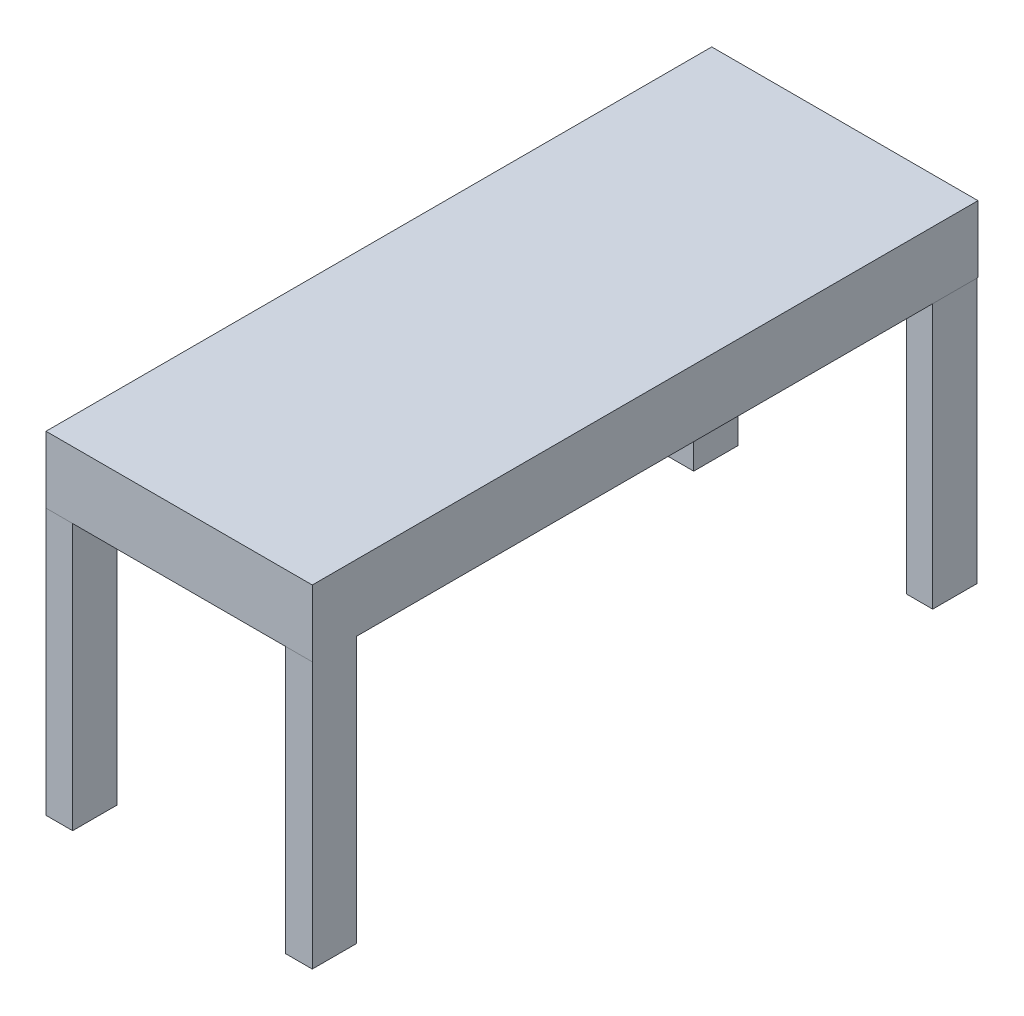
ISO-10303-21;
HEADER;
FILE_DESCRIPTION(('STEP AP214'),'2;1');
FILE_NAME('part.step','',(''),(''),'','','');
FILE_SCHEMA(('AUTOMOTIVE_DESIGN { 1 0 10303 214 1 1 1 1 }'));
ENDSEC;
DATA;
#1=APPLICATION_CONTEXT('core data for automotive mechanical design processes');
#2=APPLICATION_PROTOCOL_DEFINITION('international standard','automotive_design',2000,#1);
#3=PRODUCT_CONTEXT('',#1,'mechanical');
#4=PRODUCT('Part','Part','',(#3));
#5=PRODUCT_RELATED_PRODUCT_CATEGORY('part','',(#4));
#6=PRODUCT_DEFINITION_FORMATION('','',#4);
#7=PRODUCT_DEFINITION_CONTEXT('part definition',#1,'design');
#8=PRODUCT_DEFINITION('design','',#6,#7);
#9=PRODUCT_DEFINITION_SHAPE('','',#8);
#10=(LENGTH_UNIT() NAMED_UNIT(*) SI_UNIT(.MILLI.,.METRE.));
#11=(NAMED_UNIT(*) PLANE_ANGLE_UNIT() SI_UNIT($,.RADIAN.));
#12=(NAMED_UNIT(*) SI_UNIT($,.STERADIAN.) SOLID_ANGLE_UNIT());
#13=UNCERTAINTY_MEASURE_WITH_UNIT(LENGTH_MEASURE(1.E-05),#10,'distance_accuracy_value','');
#14=(GEOMETRIC_REPRESENTATION_CONTEXT(3) GLOBAL_UNCERTAINTY_ASSIGNED_CONTEXT((#13)) GLOBAL_UNIT_ASSIGNED_CONTEXT((#10,
#11,#12)) REPRESENTATION_CONTEXT('',''));
#15=CARTESIAN_POINT('',(0.,0.,0.));
#16=DIRECTION('',(0.,0.,1.));
#17=DIRECTION('',(1.,0.,0.));
#18=AXIS2_PLACEMENT_3D('',#15,#16,#17);
#19=CARTESIAN_POINT('',(76.2,-38.2485648275946,101.512948026485));
#20=DIRECTION('',(0.,1.,0.));
#21=DIRECTION('',(0.,0.,1.));
#22=AXIS2_PLACEMENT_3D('',#19,#20,#21);
#23=PLANE('',#22);
#24=DIRECTION('',(0.,0.,1.));
#25=VECTOR('',#24,1.);
#26=CARTESIAN_POINT('',(68.58,-38.2485648275946,-88.9913319064604));
#27=LINE('',#26,#25);
#28=CARTESIAN_POINT('',(68.58,-38.2485648275946,88.8129480264851));
#29=VERTEX_POINT('',#28);
#30=CARTESIAN_POINT('',(68.58,-38.2485648275946,101.512948026485));
#31=VERTEX_POINT('',#30);
#32=EDGE_CURVE('E200',#29,#31,#27,.T.);
#33=ORIENTED_EDGE('',*,*,#32,.F.);
#34=DIRECTION('',(-1.,0.,0.));
#35=VECTOR('',#34,1.);
#36=CARTESIAN_POINT('',(76.2,-38.2485648275946,88.8129480264851));
#37=LINE('',#36,#35);
#38=CARTESIAN_POINT('',(76.2,-38.2485648275946,88.8129480264851));
#39=VERTEX_POINT('',#38);
#40=EDGE_CURVE('E208',#39,#29,#37,.T.);
#41=ORIENTED_EDGE('',*,*,#40,.F.);
#42=DIRECTION('',(0.,0.,-1.));
#43=VECTOR('',#42,1.);
#44=CARTESIAN_POINT('',(76.2,-38.2485648275946,101.512948026485));
#45=LINE('',#44,#43);
#46=CARTESIAN_POINT('',(76.2,-38.2485648275946,101.512948026485));
#47=VERTEX_POINT('',#46);
#48=EDGE_CURVE('E217',#47,#39,#45,.T.);
#49=ORIENTED_EDGE('',*,*,#48,.F.);
#50=DIRECTION('',(-1.,0.,0.));
#51=VECTOR('',#50,1.);
#52=CARTESIAN_POINT('',(76.2,-38.2485648275946,101.512948026485));
#53=LINE('',#52,#51);
#54=EDGE_CURVE('E207',#47,#31,#53,.T.);
#55=ORIENTED_EDGE('',*,*,#54,.T.);
#56=EDGE_LOOP('',(#33,#41,#49,#55));
#57=FACE_BOUND('',#56,.T.);
#58=ADVANCED_FACE('F43',(#57),#23,.F.);
#59=CARTESIAN_POINT('',(76.0109184171338,38.1867404796572,-76.2170484762748));
#60=DIRECTION('',(0.,0.,-1.));
#61=DIRECTION('',(-1.,0.,0.));
#62=AXIS2_PLACEMENT_3D('',#59,#60,#61);
#63=PLANE('',#62);
#64=DIRECTION('',(0.,1.,0.));
#65=VECTOR('',#64,1.);
#66=CARTESIAN_POINT('',(68.58,38.1867404796572,-76.2170484762748));
#67=LINE('',#66,#65);
#68=CARTESIAN_POINT('',(68.58,-38.0132595203428,-76.2170484762748));
#69=VERTEX_POINT('',#68);
#70=CARTESIAN_POINT('',(68.58,37.8905634643858,-76.2170484762748));
#71=VERTEX_POINT('',#70);
#72=EDGE_CURVE('E414',#69,#71,#67,.T.);
#73=ORIENTED_EDGE('',*,*,#72,.F.);
#74=DIRECTION('',(-1.,0.,0.));
#75=VECTOR('',#74,1.);
#76=CARTESIAN_POINT('',(76.0109184171338,-38.0132595203428,-76.2170484762748));
#77=LINE('',#76,#75);
#78=CARTESIAN_POINT('',(76.0109184171338,-38.0132595203428,-76.2170484762748));
#79=VERTEX_POINT('',#78);
#80=EDGE_CURVE('E343',#79,#69,#77,.T.);
#81=ORIENTED_EDGE('',*,*,#80,.F.);
#82=DIRECTION('',(0.,-1.,0.));
#83=VECTOR('',#82,1.);
#84=CARTESIAN_POINT('',(76.0109184171338,38.1867404796572,-76.2170484762748));
#85=LINE('',#84,#83);
#86=CARTESIAN_POINT('',(76.0109184171338,37.8905634643858,-76.2170484762748));
#87=VERTEX_POINT('',#86);
#88=EDGE_CURVE('E323',#87,#79,#85,.T.);
#89=ORIENTED_EDGE('',*,*,#88,.F.);
#90=DIRECTION('',(1.,0.,0.));
#91=VECTOR('',#90,1.);
#92=CARTESIAN_POINT('',(76.0109184171338,37.8905634643858,-76.2170484762748));
#93=LINE('',#92,#91);
#94=EDGE_CURVE('E318',#71,#87,#93,.T.);
#95=ORIENTED_EDGE('',*,*,#94,.F.);
#96=EDGE_LOOP('',(#73,#81,#89,#95));
#97=FACE_BOUND('',#96,.T.);
#98=ADVANCED_FACE('F452',(#97),#63,.F.);
#99=CARTESIAN_POINT('',(76.0109184171338,38.1867404796572,-88.9170484762748));
#100=DIRECTION('',(0.,0.,1.));
#101=DIRECTION('',(0.,-1.,0.));
#102=AXIS2_PLACEMENT_3D('',#99,#100,#101);
#103=PLANE('',#102);
#104=DIRECTION('',(0.,-1.,0.));
#105=VECTOR('',#104,1.);
#106=CARTESIAN_POINT('',(68.58,38.1867404796572,-88.9170484762748));
#107=LINE('',#106,#105);
#108=CARTESIAN_POINT('',(68.58,37.8905634643858,-88.9170484762748));
#109=VERTEX_POINT('',#108);
#110=CARTESIAN_POINT('',(68.58,-38.0132595203428,-88.9170484762748));
#111=VERTEX_POINT('',#110);
#112=EDGE_CURVE('E60',#109,#111,#107,.T.);
#113=ORIENTED_EDGE('',*,*,#112,.F.);
#114=DIRECTION('',(-1.,0.,0.));
#115=VECTOR('',#114,1.);
#116=CARTESIAN_POINT('',(76.0109184171338,37.8905634643858,-88.9170484762748));
#117=LINE('',#116,#115);
#118=CARTESIAN_POINT('',(76.0109184171338,37.8905634643858,-88.9170484762748));
#119=VERTEX_POINT('',#118);
#120=EDGE_CURVE('E315',#119,#109,#117,.T.);
#121=ORIENTED_EDGE('',*,*,#120,.F.);
#122=DIRECTION('',(0.,1.,0.));
#123=VECTOR('',#122,1.);
#124=CARTESIAN_POINT('',(76.0109184171338,38.1867404796572,-88.9170484762748));
#125=LINE('',#124,#123);
#126=CARTESIAN_POINT('',(76.0109184171338,-38.0132595203428,-88.9170484762748));
#127=VERTEX_POINT('',#126);
#128=EDGE_CURVE('E328',#127,#119,#125,.T.);
#129=ORIENTED_EDGE('',*,*,#128,.F.);
#130=DIRECTION('',(-1.,0.,0.));
#131=VECTOR('',#130,1.);
#132=CARTESIAN_POINT('',(76.0109184171338,-38.0132595203428,-88.9170484762748));
#133=LINE('',#132,#131);
#134=EDGE_CURVE('E339',#127,#111,#133,.T.);
#135=ORIENTED_EDGE('',*,*,#134,.T.);
#136=EDGE_LOOP('',(#113,#121,#129,#135));
#137=FACE_BOUND('',#136,.T.);
#138=ADVANCED_FACE('F445',(#137),#103,.F.);
#139=CARTESIAN_POINT('',(76.0109184171338,-38.0132595203428,-76.2170484762748));
#140=DIRECTION('',(0.,1.,0.));
#141=DIRECTION('',(0.,0.,1.));
#142=AXIS2_PLACEMENT_3D('',#139,#140,#141);
#143=PLANE('',#142);
#144=DIRECTION('',(0.,0.,1.));
#145=VECTOR('',#144,1.);
#146=CARTESIAN_POINT('',(68.58,-38.0132595203428,-76.2170484762748));
#147=LINE('',#146,#145);
#148=EDGE_CURVE('E435',#111,#69,#147,.T.);
#149=ORIENTED_EDGE('',*,*,#148,.F.);
#150=ORIENTED_EDGE('',*,*,#134,.F.);
#151=DIRECTION('',(0.,0.,-1.));
#152=VECTOR('',#151,1.);
#153=CARTESIAN_POINT('',(76.0109184171338,-38.0132595203428,-76.2170484762748));
#154=LINE('',#153,#152);
#155=EDGE_CURVE('E325',#79,#127,#154,.T.);
#156=ORIENTED_EDGE('',*,*,#155,.F.);
#157=ORIENTED_EDGE('',*,*,#80,.T.);
#158=EDGE_LOOP('',(#149,#150,#156,#157));
#159=FACE_BOUND('',#158,.T.);
#160=ADVANCED_FACE('F455',(#159),#143,.F.);
#161=CARTESIAN_POINT('',(76.2,37.9514351724054,101.512948026485));
#162=DIRECTION('',(0.,0.,-1.));
#163=DIRECTION('',(-1.,0.,0.));
#164=AXIS2_PLACEMENT_3D('',#161,#162,#163);
#165=PLANE('',#164);
#166=DIRECTION('',(0.,-1.,0.));
#167=VECTOR('',#166,1.);
#168=CARTESIAN_POINT('',(7.62000000000001,0.,101.512948026485));
#169=LINE('',#168,#167);
#170=CARTESIAN_POINT('',(7.6175,37.8905634643858,101.510808060012));
#171=VERTEX_POINT('',#170);
#172=CARTESIAN_POINT('',(7.62000000000001,-38.2485648275946,101.512948026485));
#173=VERTEX_POINT('',#172);
#174=EDGE_CURVE('E181',#171,#173,#169,.T.);
#175=ORIENTED_EDGE('',*,*,#174,.F.);
#176=CARTESIAN_POINT('',(7.6175,37.8905634643858,101.512948026485));
#177=DIRECTION('',(-1.,0.,0.));
#178=VECTOR('',#177,1.);
#179=LINE('',#176,#178);
#180=CARTESIAN_POINT('',(0.,37.8905634643858,101.510808060012));
#181=VERTEX_POINT('',#180);
#182=EDGE_CURVE('E287',#171,#181,#179,.T.);
#183=ORIENTED_EDGE('',*,*,#182,.T.);
#184=DIRECTION('',(0.,1.,0.));
#185=VECTOR('',#184,1.);
#186=CARTESIAN_POINT('',(0.,37.9514351724054,101.512948026485));
#187=LINE('',#186,#185);
#188=CARTESIAN_POINT('',(0.,-38.2485648275946,101.512948026485));
#189=VERTEX_POINT('',#188);
#190=EDGE_CURVE('E205',#181,#189,#187,.F.);
#191=ORIENTED_EDGE('',*,*,#190,.T.);
#192=EDGE_CURVE('E197',#173,#189,#53,.T.);
#193=ORIENTED_EDGE('',*,*,#192,.F.);
#194=EDGE_LOOP('',(#175,#183,#191,#193));
#195=FACE_BOUND('',#194,.T.);
#196=ADVANCED_FACE('F203',(#195),#165,.F.);
#197=CARTESIAN_POINT('',(76.2,37.9514351724054,88.8129480264851));
#198=DIRECTION('',(0.,0.,1.));
#199=DIRECTION('',(1.,0.,0.));
#200=AXIS2_PLACEMENT_3D('',#197,#198,#199);
#201=PLANE('',#200);
#202=DIRECTION('',(0.,-1.,0.));
#203=VECTOR('',#202,1.);
#204=CARTESIAN_POINT('',(68.58,37.9514351724054,88.8129480264851));
#205=LINE('',#204,#203);
#206=CARTESIAN_POINT('',(68.58,37.8905634643858,88.8129480264851));
#207=VERTEX_POINT('',#206);
#208=EDGE_CURVE('E52',#207,#29,#205,.T.);
#209=ORIENTED_EDGE('',*,*,#208,.F.);
#210=DIRECTION('',(1.,0.,0.));
#211=VECTOR('',#210,1.);
#212=CARTESIAN_POINT('',(76.2,37.8905634643858,88.8129480264851));
#213=LINE('',#212,#211);
#214=CARTESIAN_POINT('',(76.2,37.8905634643858,88.8129480264851));
#215=VERTEX_POINT('',#214);
#216=EDGE_CURVE('E211',#207,#215,#213,.T.);
#217=ORIENTED_EDGE('',*,*,#216,.T.);
#218=DIRECTION('',(0.,1.,0.));
#219=VECTOR('',#218,1.);
#220=CARTESIAN_POINT('',(76.2,37.9514351724054,88.8129480264851));
#221=LINE('',#220,#219);
#222=EDGE_CURVE('E219',#39,#215,#221,.T.);
#223=ORIENTED_EDGE('',*,*,#222,.F.);
#224=ORIENTED_EDGE('',*,*,#40,.T.);
#225=EDGE_LOOP('',(#209,#217,#223,#224));
#226=FACE_BOUND('',#225,.T.);
#227=ADVANCED_FACE('F359',(#226),#201,.F.);
#228=CARTESIAN_POINT('',(7.62,-38.0132595203428,-76.2170484762748));
#229=VERTEX_POINT('',#228);
#230=CARTESIAN_POINT('',(0.,-38.0132595203428,-76.2170484762748));
#231=VERTEX_POINT('',#230);
#232=EDGE_CURVE('E342',#229,#231,#77,.T.);
#233=ORIENTED_EDGE('',*,*,#232,.F.);
#234=DIRECTION('',(0.,1.,0.));
#235=VECTOR('',#234,1.);
#236=CARTESIAN_POINT('',(7.62,38.1867404796572,-76.2170484762748));
#237=LINE('',#236,#235);
#238=CARTESIAN_POINT('',(7.62,37.8905634643858,-76.2170484762748));
#239=VERTEX_POINT('',#238);
#240=EDGE_CURVE('E365',#229,#239,#237,.T.);
#241=ORIENTED_EDGE('',*,*,#240,.T.);
#242=CARTESIAN_POINT('',(0.,37.8905634643858,-76.2170484762748));
#243=VERTEX_POINT('',#242);
#244=EDGE_CURVE('E319',#243,#239,#93,.T.);
#245=ORIENTED_EDGE('',*,*,#244,.F.);
#246=DIRECTION('',(0.,-1.,0.));
#247=VECTOR('',#246,1.);
#248=CARTESIAN_POINT('',(0.,38.1867404796572,-76.2170484762748));
#249=LINE('',#248,#247);
#250=EDGE_CURVE('E322',#243,#231,#249,.T.);
#251=ORIENTED_EDGE('',*,*,#250,.T.);
#252=EDGE_LOOP('',(#233,#241,#245,#251));
#253=FACE_BOUND('',#252,.T.);
#254=ADVANCED_FACE('F45',(#253),#63,.F.);
#255=CARTESIAN_POINT('',(7.62,37.8905634643858,-88.9170484762748));
#256=VERTEX_POINT('',#255);
#257=CARTESIAN_POINT('',(0.,37.8905634643858,-88.9170484762748));
#258=VERTEX_POINT('',#257);
#259=EDGE_CURVE('E296',#256,#258,#117,.T.);
#260=ORIENTED_EDGE('',*,*,#259,.F.);
#261=DIRECTION('',(0.,-1.,0.));
#262=VECTOR('',#261,1.);
#263=CARTESIAN_POINT('',(7.62,38.1867404796572,-88.9170484762748));
#264=LINE('',#263,#262);
#265=CARTESIAN_POINT('',(7.62,-38.0132595203428,-88.9170484762748));
#266=VERTEX_POINT('',#265);
#267=EDGE_CURVE('E373',#256,#266,#264,.T.);
#268=ORIENTED_EDGE('',*,*,#267,.T.);
#269=CARTESIAN_POINT('',(0.,-38.0132595203428,-88.9170484762748));
#270=VERTEX_POINT('',#269);
#271=EDGE_CURVE('E331',#266,#270,#133,.T.);
#272=ORIENTED_EDGE('',*,*,#271,.T.);
#273=DIRECTION('',(0.,1.,0.));
#274=VECTOR('',#273,1.);
#275=CARTESIAN_POINT('',(0.,38.1867404796572,-88.9170484762748));
#276=LINE('',#275,#274);
#277=EDGE_CURVE('E326',#270,#258,#276,.T.);
#278=ORIENTED_EDGE('',*,*,#277,.T.);
#279=EDGE_LOOP('',(#260,#268,#272,#278));
#280=FACE_BOUND('',#279,.T.);
#281=ADVANCED_FACE('F441',(#280),#103,.F.);
#282=CARTESIAN_POINT('',(76.0109184171338,0.,0.));
#283=DIRECTION('',(1.,0.,0.));
#284=DIRECTION('',(0.,0.,-1.));
#285=AXIS2_PLACEMENT_3D('',#282,#283,#284);
#286=PLANE('',#285);
#287=ORIENTED_EDGE('',*,*,#128,.T.);
#288=DIRECTION('',(0.,0.,1.));
#289=VECTOR('',#288,1.);
#290=CARTESIAN_POINT('',(76.0109184171338,37.8905634643858,0.));
#291=LINE('',#290,#289);
#292=EDGE_CURVE('E346',#119,#87,#291,.T.);
#293=ORIENTED_EDGE('',*,*,#292,.T.);
#294=ORIENTED_EDGE('',*,*,#88,.T.);
#295=ORIENTED_EDGE('',*,*,#155,.T.);
#296=EDGE_LOOP('',(#287,#293,#294,#295));
#297=FACE_BOUND('',#296,.T.);
#298=ADVANCED_FACE('F443',(#297),#286,.T.);
#299=ORIENTED_EDGE('',*,*,#271,.F.);
#300=DIRECTION('',(0.,0.,1.));
#301=VECTOR('',#300,1.);
#302=CARTESIAN_POINT('',(7.62,-38.0132595203428,-76.2170484762748));
#303=LINE('',#302,#301);
#304=EDGE_CURVE('E411',#266,#229,#303,.T.);
#305=ORIENTED_EDGE('',*,*,#304,.T.);
#306=ORIENTED_EDGE('',*,*,#232,.T.);
#307=DIRECTION('',(0.,0.,-1.));
#308=VECTOR('',#307,1.);
#309=CARTESIAN_POINT('',(0.,-38.0132595203428,-76.2170484762748));
#310=LINE('',#309,#308);
#311=EDGE_CURVE('E334',#231,#270,#310,.T.);
#312=ORIENTED_EDGE('',*,*,#311,.T.);
#313=EDGE_LOOP('',(#299,#305,#306,#312));
#314=FACE_BOUND('',#313,.T.);
#315=ADVANCED_FACE('F409',(#314),#143,.F.);
#316=CARTESIAN_POINT('',(0.,0.,0.));
#317=DIRECTION('',(1.,0.,0.));
#318=DIRECTION('',(0.,0.,-1.));
#319=AXIS2_PLACEMENT_3D('',#316,#317,#318);
#320=PLANE('',#319);
#321=ORIENTED_EDGE('',*,*,#250,.F.);
#322=DIRECTION('',(0.,0.,-1.));
#323=VECTOR('',#322,1.);
#324=CARTESIAN_POINT('',(0.,37.8905634643858,-88.9913319064604));
#325=LINE('',#324,#323);
#326=CARTESIAN_POINT('',(0.,37.8905634643858,88.8129480264851));
#327=VERTEX_POINT('',#326);
#328=EDGE_CURVE('E305',#327,#243,#325,.T.);
#329=ORIENTED_EDGE('',*,*,#328,.F.);
#330=DIRECTION('',(0.,1.,0.));
#331=VECTOR('',#330,1.);
#332=CARTESIAN_POINT('',(0.,37.9514351724054,88.8129480264851));
#333=LINE('',#332,#331);
#334=CARTESIAN_POINT('',(0.,-38.2485648275946,88.8129480264851));
#335=VERTEX_POINT('',#334);
#336=EDGE_CURVE('E367',#335,#327,#333,.T.);
#337=ORIENTED_EDGE('',*,*,#336,.F.);
#338=DIRECTION('',(0.,0.,-1.));
#339=VECTOR('',#338,1.);
#340=CARTESIAN_POINT('',(0.,-38.2485648275946,101.512948026485));
#341=LINE('',#340,#339);
#342=EDGE_CURVE('E216',#189,#335,#341,.T.);
#343=ORIENTED_EDGE('',*,*,#342,.F.);
#344=ORIENTED_EDGE('',*,*,#190,.F.);
#345=DIRECTION('',(0.,1.,0.));
#346=VECTOR('',#345,1.);
#347=CARTESIAN_POINT('',(0.,37.8905634643858,101.50866809354));
#348=LINE('',#347,#346);
#349=CARTESIAN_POINT('',(0.,37.9514351724054,101.50866809354));
#350=VERTEX_POINT('',#349);
#351=EDGE_CURVE('E300',#350,#181,#348,.F.);
#352=ORIENTED_EDGE('',*,*,#351,.F.);
#353=DIRECTION('',(0.,1.,0.));
#354=VECTOR('',#353,1.);
#355=CARTESIAN_POINT('',(0.,37.8905634643858,101.50866809354));
#356=LINE('',#355,#354);
#357=CARTESIAN_POINT('',(0.,56.9405634643858,101.50866809354));
#358=VERTEX_POINT('',#357);
#359=EDGE_CURVE('E312',#358,#350,#356,.F.);
#360=ORIENTED_EDGE('',*,*,#359,.F.);
#361=DIRECTION('',(0.,0.,1.));
#362=VECTOR('',#361,1.);
#363=CARTESIAN_POINT('',(0.,56.9405634643858,101.50866809354));
#364=LINE('',#363,#362);
#365=CARTESIAN_POINT('',(0.,56.9405634643858,-88.9913319064604));
#366=VERTEX_POINT('',#365);
#367=EDGE_CURVE('E298',#366,#358,#364,.T.);
#368=ORIENTED_EDGE('',*,*,#367,.F.);
#369=DIRECTION('',(0.,1.,0.));
#370=VECTOR('',#369,1.);
#371=CARTESIAN_POINT('',(0.,56.9405634643858,-88.9913319064604));
#372=LINE('',#371,#370);
#373=CARTESIAN_POINT('',(0.,37.8905634643858,-88.9913319064604));
#374=VERTEX_POINT('',#373);
#375=EDGE_CURVE('E224',#374,#366,#372,.T.);
#376=ORIENTED_EDGE('',*,*,#375,.F.);
#377=EDGE_CURVE('E308',#258,#374,#325,.T.);
#378=ORIENTED_EDGE('',*,*,#377,.F.);
#379=ORIENTED_EDGE('',*,*,#277,.F.);
#380=ORIENTED_EDGE('',*,*,#311,.F.);
#381=EDGE_LOOP('',(#321,#329,#337,#343,#344,#352,#360,#368,#376,#378,#379,#380));
#382=FACE_BOUND('',#381,.T.);
#383=ADVANCED_FACE('F260',(#382),#320,.F.);
#384=CARTESIAN_POINT('',(76.2,37.8905634643858,-88.9913319064604));
#385=DIRECTION('',(0.,1.,0.));
#386=DIRECTION('',(0.,0.,1.));
#387=AXIS2_PLACEMENT_3D('',#384,#385,#386);
#388=PLANE('',#387);
#389=DIRECTION('',(0.,0.,1.));
#390=VECTOR('',#389,1.);
#391=CARTESIAN_POINT('',(68.58,37.8905634643858,-88.9913319064604));
#392=LINE('',#391,#390);
#393=EDGE_CURVE('E421',#109,#71,#392,.T.);
#394=ORIENTED_EDGE('',*,*,#393,.T.);
#395=ORIENTED_EDGE('',*,*,#94,.T.);
#396=ORIENTED_EDGE('',*,*,#292,.F.);
#397=ORIENTED_EDGE('',*,*,#120,.T.);
#398=EDGE_LOOP('',(#394,#395,#396,#397));
#399=FACE_BOUND('',#398,.T.);
#400=ORIENTED_EDGE('',*,*,#244,.T.);
#401=DIRECTION('',(0.,0.,1.));
#402=VECTOR('',#401,1.);
#403=CARTESIAN_POINT('',(7.62,37.8905634643858,-88.9913319064604));
#404=LINE('',#403,#402);
#405=EDGE_CURVE('E420',#256,#239,#404,.T.);
#406=ORIENTED_EDGE('',*,*,#405,.F.);
#407=ORIENTED_EDGE('',*,*,#259,.T.);
#408=ORIENTED_EDGE('',*,*,#377,.T.);
#409=DIRECTION('',(-1.,0.,0.));
#410=VECTOR('',#409,1.);
#411=CARTESIAN_POINT('',(76.2,37.8905634643858,-88.9913319064604));
#412=LINE('',#411,#410);
#413=CARTESIAN_POINT('',(76.2,37.8905634643858,-88.9913319064604));
#414=VERTEX_POINT('',#413);
#415=EDGE_CURVE('E288',#414,#374,#412,.T.);
#416=ORIENTED_EDGE('',*,*,#415,.F.);
#417=DIRECTION('',(0.,0.,-1.));
#418=VECTOR('',#417,1.);
#419=CARTESIAN_POINT('',(76.2,37.8905634643858,-88.9913319064604));
#420=LINE('',#419,#418);
#421=EDGE_CURVE('E290',#215,#414,#420,.T.);
#422=ORIENTED_EDGE('',*,*,#421,.F.);
#423=ORIENTED_EDGE('',*,*,#216,.F.);
#424=CARTESIAN_POINT('',(68.5825,37.8905634643858,101.510808060012));
#425=VERTEX_POINT('',#424);
#426=EDGE_CURVE('E68',#207,#425,#392,.T.);
#427=ORIENTED_EDGE('',*,*,#426,.T.);
#428=DIRECTION('',(-1.,0.,0.));
#429=VECTOR('',#428,1.);
#430=CARTESIAN_POINT('',(0.,37.8905634643858,101.50866809354));
#431=LINE('',#430,#429);
#432=EDGE_CURVE('E201',#425,#171,#431,.T.);
#433=ORIENTED_EDGE('',*,*,#432,.T.);
#434=CARTESIAN_POINT('',(7.62,37.8905634643858,88.8129480264851));
#435=VERTEX_POINT('',#434);
#436=EDGE_CURVE('E186',#435,#171,#404,.T.);
#437=ORIENTED_EDGE('',*,*,#436,.F.);
#438=EDGE_CURVE('E221',#327,#435,#213,.T.);
#439=ORIENTED_EDGE('',*,*,#438,.F.);
#440=ORIENTED_EDGE('',*,*,#328,.T.);
#441=EDGE_LOOP('',(#400,#406,#407,#408,#416,#422,#423,#427,#433,#437,#439,#440));
#442=FACE_BOUND('',#441,.T.);
#443=ADVANCED_FACE('F256',(#399,#442),#388,.F.);
#444=CARTESIAN_POINT('',(76.2,56.9405634643858,-88.9913319064604));
#445=DIRECTION('',(0.,0.,1.));
#446=DIRECTION('',(0.,-1.,0.));
#447=AXIS2_PLACEMENT_3D('',#444,#445,#446);
#448=PLANE('',#447);
#449=ORIENTED_EDGE('',*,*,#375,.T.);
#450=DIRECTION('',(-1.,0.,0.));
#451=VECTOR('',#450,1.);
#452=CARTESIAN_POINT('',(76.2,56.9405634643858,-88.9913319064604));
#453=LINE('',#452,#451);
#454=CARTESIAN_POINT('',(76.2,56.9405634643858,-88.9913319064604));
#455=VERTEX_POINT('',#454);
#456=EDGE_CURVE('E293',#455,#366,#453,.T.);
#457=ORIENTED_EDGE('',*,*,#456,.F.);
#458=DIRECTION('',(0.,1.,0.));
#459=VECTOR('',#458,1.);
#460=CARTESIAN_POINT('',(76.2,56.9405634643858,-88.9913319064604));
#461=LINE('',#460,#459);
#462=EDGE_CURVE('E236',#414,#455,#461,.T.);
#463=ORIENTED_EDGE('',*,*,#462,.F.);
#464=ORIENTED_EDGE('',*,*,#415,.T.);
#465=EDGE_LOOP('',(#449,#457,#463,#464));
#466=FACE_BOUND('',#465,.T.);
#467=ADVANCED_FACE('F259',(#466),#448,.F.);
#468=CARTESIAN_POINT('',(76.2,56.9405634643858,101.50866809354));
#469=DIRECTION('',(0.,-1.,0.));
#470=DIRECTION('',(0.,0.,-1.));
#471=AXIS2_PLACEMENT_3D('',#468,#469,#470);
#472=PLANE('',#471);
#473=ORIENTED_EDGE('',*,*,#367,.T.);
#474=DIRECTION('',(-1.,0.,0.));
#475=VECTOR('',#474,1.);
#476=CARTESIAN_POINT('',(76.2,56.9405634643858,101.50866809354));
#477=LINE('',#476,#475);
#478=CARTESIAN_POINT('',(76.2,56.9405634643858,101.50866809354));
#479=VERTEX_POINT('',#478);
#480=EDGE_CURVE('E297',#479,#358,#477,.T.);
#481=ORIENTED_EDGE('',*,*,#480,.F.);
#482=DIRECTION('',(0.,0.,1.));
#483=VECTOR('',#482,1.);
#484=CARTESIAN_POINT('',(76.2,56.9405634643858,101.50866809354));
#485=LINE('',#484,#483);
#486=EDGE_CURVE('E386',#455,#479,#485,.T.);
#487=ORIENTED_EDGE('',*,*,#486,.F.);
#488=ORIENTED_EDGE('',*,*,#456,.T.);
#489=EDGE_LOOP('',(#473,#481,#487,#488));
#490=FACE_BOUND('',#489,.T.);
#491=ADVANCED_FACE('F265',(#490),#472,.F.);
#492=CARTESIAN_POINT('',(76.2,37.8905634643858,101.50866809354));
#493=DIRECTION('',(0.,0.,-1.));
#494=DIRECTION('',(-1.,0.,0.));
#495=AXIS2_PLACEMENT_3D('',#492,#493,#494);
#496=PLANE('',#495);
#497=DIRECTION('',(0.,1.,0.));
#498=VECTOR('',#497,1.);
#499=CARTESIAN_POINT('',(76.2,0.,101.50866809354));
#500=LINE('',#499,#498);
#501=CARTESIAN_POINT('',(76.2,37.9514351724054,101.50866809354));
#502=VERTEX_POINT('',#501);
#503=CARTESIAN_POINT('',(76.2,37.8905634643858,101.510808060012));
#504=VERTEX_POINT('',#503);
#505=EDGE_CURVE('E382',#502,#504,#500,.F.);
#506=ORIENTED_EDGE('',*,*,#505,.F.);
#507=DIRECTION('',(0.,1.,0.));
#508=VECTOR('',#507,1.);
#509=CARTESIAN_POINT('',(76.2,0.,101.50866809354));
#510=LINE('',#509,#508);
#511=EDGE_CURVE('E379',#479,#502,#510,.F.);
#512=ORIENTED_EDGE('',*,*,#511,.F.);
#513=ORIENTED_EDGE('',*,*,#480,.T.);
#514=ORIENTED_EDGE('',*,*,#359,.T.);
#515=ORIENTED_EDGE('',*,*,#351,.T.);
#516=ORIENTED_EDGE('',*,*,#182,.F.);
#517=ORIENTED_EDGE('',*,*,#432,.F.);
#518=CARTESIAN_POINT('',(76.2,37.8905634643858,101.512948026485));
#519=DIRECTION('',(-1.,0.,0.));
#520=VECTOR('',#519,1.);
#521=LINE('',#518,#520);
#522=EDGE_CURVE('E231',#504,#425,#521,.T.);
#523=ORIENTED_EDGE('',*,*,#522,.F.);
#524=EDGE_LOOP('',(#506,#512,#513,#514,#515,#516,#517,#523));
#525=FACE_BOUND('',#524,.T.);
#526=ADVANCED_FACE('F254',(#525),#496,.F.);
#527=CARTESIAN_POINT('',(76.2,0.,0.));
#528=DIRECTION('',(-1.,0.,0.));
#529=DIRECTION('',(0.,0.,1.));
#530=AXIS2_PLACEMENT_3D('',#527,#528,#529);
#531=PLANE('',#530);
#532=ORIENTED_EDGE('',*,*,#505,.T.);
#533=DIRECTION('',(0.,1.,0.));
#534=VECTOR('',#533,1.);
#535=CARTESIAN_POINT('',(76.2,0.,101.512948026485));
#536=LINE('',#535,#534);
#537=EDGE_CURVE('E220',#504,#47,#536,.F.);
#538=ORIENTED_EDGE('',*,*,#537,.T.);
#539=ORIENTED_EDGE('',*,*,#48,.T.);
#540=ORIENTED_EDGE('',*,*,#222,.T.);
#541=ORIENTED_EDGE('',*,*,#421,.T.);
#542=ORIENTED_EDGE('',*,*,#462,.T.);
#543=ORIENTED_EDGE('',*,*,#486,.T.);
#544=ORIENTED_EDGE('',*,*,#511,.T.);
#545=EDGE_LOOP('',(#532,#538,#539,#540,#541,#542,#543,#544));
#546=FACE_BOUND('',#545,.T.);
#547=ADVANCED_FACE('F250',(#546),#531,.F.);
#548=ORIENTED_EDGE('',*,*,#522,.T.);
#549=DIRECTION('',(0.,-1.,0.));
#550=VECTOR('',#549,1.);
#551=CARTESIAN_POINT('',(68.58,0.,101.512948026485));
#552=LINE('',#551,#550);
#553=EDGE_CURVE('E191',#425,#31,#552,.T.);
#554=ORIENTED_EDGE('',*,*,#553,.T.);
#555=ORIENTED_EDGE('',*,*,#54,.F.);
#556=ORIENTED_EDGE('',*,*,#537,.F.);
#557=EDGE_LOOP('',(#548,#554,#555,#556));
#558=FACE_BOUND('',#557,.T.);
#559=ADVANCED_FACE('F239',(#558),#165,.F.);
#560=ORIENTED_EDGE('',*,*,#438,.T.);
#561=DIRECTION('',(0.,-1.,0.));
#562=VECTOR('',#561,1.);
#563=CARTESIAN_POINT('',(7.62,37.9514351724054,88.8129480264851));
#564=LINE('',#563,#562);
#565=CARTESIAN_POINT('',(7.62000000000001,-38.2485648275946,88.8129480264851));
#566=VERTEX_POINT('',#565);
#567=EDGE_CURVE('E11',#435,#566,#564,.T.);
#568=ORIENTED_EDGE('',*,*,#567,.T.);
#569=EDGE_CURVE('E199',#566,#335,#37,.T.);
#570=ORIENTED_EDGE('',*,*,#569,.T.);
#571=ORIENTED_EDGE('',*,*,#336,.T.);
#572=EDGE_LOOP('',(#560,#568,#570,#571));
#573=FACE_BOUND('',#572,.T.);
#574=ADVANCED_FACE('F249',(#573),#201,.F.);
#575=ORIENTED_EDGE('',*,*,#569,.F.);
#576=DIRECTION('',(0.,0.,1.));
#577=VECTOR('',#576,1.);
#578=CARTESIAN_POINT('',(7.62000000000001,-38.2485648275946,-88.9913319064604));
#579=LINE('',#578,#577);
#580=EDGE_CURVE('E184',#566,#173,#579,.T.);
#581=ORIENTED_EDGE('',*,*,#580,.T.);
#582=ORIENTED_EDGE('',*,*,#192,.T.);
#583=ORIENTED_EDGE('',*,*,#342,.T.);
#584=EDGE_LOOP('',(#575,#581,#582,#583));
#585=FACE_BOUND('',#584,.T.);
#586=ADVANCED_FACE('F195',(#585),#23,.F.);
#587=CARTESIAN_POINT('',(68.58,0.,-88.9913319064604));
#588=DIRECTION('',(-1.,0.,0.));
#589=DIRECTION('',(0.,-1.,0.));
#590=AXIS2_PLACEMENT_3D('',#587,#588,#589);
#591=PLANE('',#590);
#592=ORIENTED_EDGE('',*,*,#208,.T.);
#593=ORIENTED_EDGE('',*,*,#32,.T.);
#594=ORIENTED_EDGE('',*,*,#553,.F.);
#595=ORIENTED_EDGE('',*,*,#426,.F.);
#596=EDGE_LOOP('',(#592,#593,#594,#595));
#597=FACE_BOUND('',#596,.T.);
#598=ADVANCED_FACE('F350',(#597),#591,.T.);
#599=CARTESIAN_POINT('',(7.62000000000001,0.,-88.9913319064604));
#600=DIRECTION('',(-1.,0.,0.));
#601=DIRECTION('',(0.,-1.,0.));
#602=AXIS2_PLACEMENT_3D('',#599,#600,#601);
#603=PLANE('',#602);
#604=ORIENTED_EDGE('',*,*,#436,.T.);
#605=ORIENTED_EDGE('',*,*,#174,.T.);
#606=ORIENTED_EDGE('',*,*,#580,.F.);
#607=ORIENTED_EDGE('',*,*,#567,.F.);
#608=EDGE_LOOP('',(#604,#605,#606,#607));
#609=FACE_BOUND('',#608,.T.);
#610=ADVANCED_FACE('F183',(#609),#603,.F.);
#611=ORIENTED_EDGE('',*,*,#304,.F.);
#612=ORIENTED_EDGE('',*,*,#267,.F.);
#613=ORIENTED_EDGE('',*,*,#405,.T.);
#614=ORIENTED_EDGE('',*,*,#240,.F.);
#615=EDGE_LOOP('',(#611,#612,#613,#614));
#616=FACE_BOUND('',#615,.T.);
#617=ADVANCED_FACE('F438',(#616),#603,.F.);
#618=ORIENTED_EDGE('',*,*,#72,.T.);
#619=ORIENTED_EDGE('',*,*,#393,.F.);
#620=ORIENTED_EDGE('',*,*,#112,.T.);
#621=ORIENTED_EDGE('',*,*,#148,.T.);
#622=EDGE_LOOP('',(#618,#619,#620,#621));
#623=FACE_BOUND('',#622,.T.);
#624=ADVANCED_FACE('F468',(#623),#591,.T.);
#625=CLOSED_SHELL('',(#58,#98,#138,#160,#196,#227,#254,#281,#298,#315,#383,#443,#467,#491,#526,
#547,#559,#574,#586,#598,#610,#617,#624));
#626=MANIFOLD_SOLID_BREP('B2',#625);
#627=ADVANCED_BREP_SHAPE_REPRESENTATION('',(#18,#626),#14);
#628=SHAPE_DEFINITION_REPRESENTATION(#9,#627);
ENDSEC;
END-ISO-10303-21;
